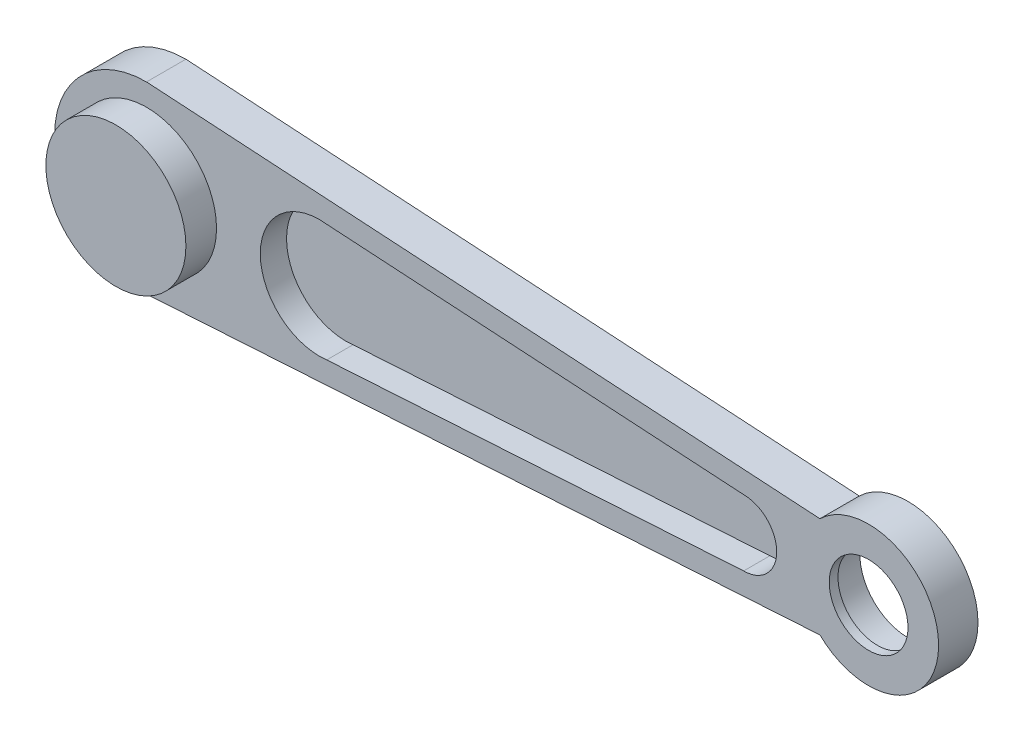
ISO-10303-21;
HEADER;
FILE_DESCRIPTION(('STEP AP214'),'2;1');
FILE_NAME('part.step','',(''),(''),'','','');
FILE_SCHEMA(('AUTOMOTIVE_DESIGN { 1 0 10303 214 1 1 1 1 }'));
ENDSEC;
DATA;
#1=APPLICATION_CONTEXT('core data for automotive mechanical design processes');
#2=APPLICATION_PROTOCOL_DEFINITION('international standard','automotive_design',2000,#1);
#3=PRODUCT_CONTEXT('',#1,'mechanical');
#4=PRODUCT('Part','Part','',(#3));
#5=PRODUCT_RELATED_PRODUCT_CATEGORY('part','',(#4));
#6=PRODUCT_DEFINITION_FORMATION('','',#4);
#7=PRODUCT_DEFINITION_CONTEXT('part definition',#1,'design');
#8=PRODUCT_DEFINITION('design','',#6,#7);
#9=PRODUCT_DEFINITION_SHAPE('','',#8);
#10=(LENGTH_UNIT() NAMED_UNIT(*) SI_UNIT(.MILLI.,.METRE.));
#11=(NAMED_UNIT(*) PLANE_ANGLE_UNIT() SI_UNIT($,.RADIAN.));
#12=(NAMED_UNIT(*) SI_UNIT($,.STERADIAN.) SOLID_ANGLE_UNIT());
#13=UNCERTAINTY_MEASURE_WITH_UNIT(LENGTH_MEASURE(1.E-05),#10,'distance_accuracy_value','');
#14=(GEOMETRIC_REPRESENTATION_CONTEXT(3) GLOBAL_UNCERTAINTY_ASSIGNED_CONTEXT((#13)) GLOBAL_UNIT_ASSIGNED_CONTEXT((#10,
#11,#12)) REPRESENTATION_CONTEXT('',''));
#15=CARTESIAN_POINT('',(0.,0.,0.));
#16=DIRECTION('',(0.,0.,1.));
#17=DIRECTION('',(1.,0.,0.));
#18=AXIS2_PLACEMENT_3D('',#15,#16,#17);
#19=CARTESIAN_POINT('',(0.979753678770363,15.8997190445717,9.));
#20=DIRECTION('',(0.0615041582195713,0.998106827209243,0.));
#21=DIRECTION('',(-0.998106827209243,0.0615041582195713,0.));
#22=AXIS2_PLACEMENT_3D('',#19,#20,#21);
#23=PLANE('',#22);
#24=DIRECTION('',(0.,0.,-1.));
#25=VECTOR('',#24,1.);
#26=CARTESIAN_POINT('',(39.5245567833211,13.5245567833206,9.));
#27=LINE('',#26,#25);
#28=CARTESIAN_POINT('',(39.5245567833211,13.5245567833206,3.));
#29=VERTEX_POINT('',#28);
#30=CARTESIAN_POINT('',(39.5245567833211,13.5245567833206,0.));
#31=VERTEX_POINT('',#30);
#32=EDGE_CURVE('E12',#29,#31,#27,.T.);
#33=ORIENTED_EDGE('',*,*,#32,.F.);
#34=DIRECTION('',(0.998106827209243,-0.0615041582195713,0.));
#35=VECTOR('',#34,1.);
#36=CARTESIAN_POINT('',(0.979753678770363,15.8997190445717,3.));
#37=LINE('',#36,#35);
#38=CARTESIAN_POINT('',(41.1850401991683,13.4222364384986,3.));
#39=VERTEX_POINT('',#38);
#40=EDGE_CURVE('E233',#29,#39,#37,.T.);
#41=ORIENTED_EDGE('',*,*,#40,.T.);
#42=DIRECTION('',(0.,0.,-1.));
#43=VECTOR('',#42,1.);
#44=CARTESIAN_POINT('',(41.1850401991683,13.4222364384986,9.));
#45=LINE('',#44,#43);
#46=CARTESIAN_POINT('',(41.1850401991683,13.4222364384986,0.));
#47=VERTEX_POINT('',#46);
#48=EDGE_CURVE('E110',#39,#47,#45,.T.);
#49=ORIENTED_EDGE('',*,*,#48,.T.);
#50=DIRECTION('',(0.998106827209243,-0.0615041582195713,0.));
#51=VECTOR('',#50,1.);
#52=CARTESIAN_POINT('',(0.979753678770363,15.8997190445717,0.));
#53=LINE('',#52,#51);
#54=EDGE_CURVE('E192',#31,#47,#53,.T.);
#55=ORIENTED_EDGE('',*,*,#54,.F.);
#56=EDGE_LOOP('',(#33,#41,#49,#55));
#57=FACE_BOUND('',#56,.T.);
#58=ADVANCED_FACE('F50',(#57),#23,.T.);
#59=CARTESIAN_POINT('',(0.979753678770363,-15.8997190445717,9.));
#60=DIRECTION('',(-0.0615041582195713,0.998106827209243,0.));
#61=DIRECTION('',(-0.998106827209243,-0.0615041582195713,0.));
#62=AXIS2_PLACEMENT_3D('',#59,#60,#61);
#63=PLANE('',#62);
#64=DIRECTION('',(0.998106827209243,0.0615041582195713,0.));
#65=VECTOR('',#64,1.);
#66=CARTESIAN_POINT('',(0.979753678770363,-15.8997190445717,3.));
#67=LINE('',#66,#65);
#68=CARTESIAN_POINT('',(39.5245567833211,-13.5245567833206,3.));
#69=VERTEX_POINT('',#68);
#70=CARTESIAN_POINT('',(41.1850401991683,-13.4222364384986,3.));
#71=VERTEX_POINT('',#70);
#72=EDGE_CURVE('E245',#69,#71,#67,.T.);
#73=ORIENTED_EDGE('',*,*,#72,.F.);
#74=DIRECTION('',(0.,0.,-1.));
#75=VECTOR('',#74,1.);
#76=CARTESIAN_POINT('',(39.5245567833211,-13.5245567833206,9.));
#77=LINE('',#76,#75);
#78=CARTESIAN_POINT('',(39.5245567833211,-13.5245567833206,0.));
#79=VERTEX_POINT('',#78);
#80=EDGE_CURVE('E154',#69,#79,#77,.T.);
#81=ORIENTED_EDGE('',*,*,#80,.T.);
#82=DIRECTION('',(0.998106827209243,0.0615041582195713,0.));
#83=VECTOR('',#82,1.);
#84=CARTESIAN_POINT('',(0.979753678770363,-15.8997190445717,0.));
#85=LINE('',#84,#83);
#86=CARTESIAN_POINT('',(41.1850401991683,-13.4222364384986,0.));
#87=VERTEX_POINT('',#86);
#88=EDGE_CURVE('E188',#79,#87,#85,.T.);
#89=ORIENTED_EDGE('',*,*,#88,.T.);
#90=DIRECTION('',(0.,0.,-1.));
#91=VECTOR('',#90,1.);
#92=CARTESIAN_POINT('',(41.1850401991683,-13.4222364384986,9.));
#93=LINE('',#92,#91);
#94=EDGE_CURVE('E152',#71,#87,#93,.T.);
#95=ORIENTED_EDGE('',*,*,#94,.F.);
#96=EDGE_LOOP('',(#73,#81,#89,#95));
#97=FACE_BOUND('',#96,.T.);
#98=ADVANCED_FACE('F221',(#97),#63,.F.);
#99=CARTESIAN_POINT('',(0.,0.,9.));
#100=DIRECTION('',(0.,0.,1.));
#101=DIRECTION('',(1.,0.,0.));
#102=AXIS2_PLACEMENT_3D('',#99,#100,#101);
#103=PLANE('',#102);
#104=DIRECTION('',(0.998099631751839,0.0616208170737997,0.));
#105=VECTOR('',#104,1.);
#106=CARTESIAN_POINT('',(1.29157801142174,-20.9202603729663,9.));
#107=LINE('',#106,#105);
#108=CARTESIAN_POINT('',(0.,-21.,9.));
#109=VERTEX_POINT('',#108);
#110=CARTESIAN_POINT('',(153.875702269356,-11.5,9.));
#111=VERTEX_POINT('',#110);
#112=EDGE_CURVE('E260',#109,#111,#107,.T.);
#113=ORIENTED_EDGE('',*,*,#112,.T.);
#114=CARTESIAN_POINT('',(165.,0.,9.));
#115=DIRECTION('',(0.,0.,1.));
#116=DIRECTION('',(1.,0.,0.));
#117=AXIS2_PLACEMENT_3D('',#114,#115,#116);
#118=CIRCLE('',#117,16.);
#119=CARTESIAN_POINT('',(153.875702269356,11.5,9.));
#120=VERTEX_POINT('',#119);
#121=EDGE_CURVE('E114',#111,#120,#118,.T.);
#122=ORIENTED_EDGE('',*,*,#121,.T.);
#123=DIRECTION('',(0.998099631751839,-0.0616208170737997,0.));
#124=VECTOR('',#123,1.);
#125=CARTESIAN_POINT('',(1.29157801142174,20.9202603729663,9.));
#126=LINE('',#125,#124);
#127=CARTESIAN_POINT('',(0.,21.,9.));
#128=VERTEX_POINT('',#127);
#129=EDGE_CURVE('E171',#128,#120,#126,.T.);
#130=ORIENTED_EDGE('',*,*,#129,.F.);
#131=CARTESIAN_POINT('',(0.,0.,9.));
#132=DIRECTION('',(0.,0.,1.));
#133=DIRECTION('',(1.,0.,0.));
#134=AXIS2_PLACEMENT_3D('',#131,#132,#133);
#135=CIRCLE('',#134,21.);
#136=EDGE_CURVE('E73',#128,#109,#135,.T.);
#137=ORIENTED_EDGE('',*,*,#136,.T.);
#138=EDGE_LOOP('',(#113,#122,#130,#137));
#139=FACE_BOUND('',#138,.T.);
#140=CARTESIAN_POINT('',(165.,0.,9.));
#141=DIRECTION('',(0.,0.,1.));
#142=DIRECTION('',(1.,0.,0.));
#143=AXIS2_PLACEMENT_3D('',#140,#141,#142);
#144=CIRCLE('',#143,9.00000000000001);
#145=CARTESIAN_POINT('',(174.,0.,9.));
#146=VERTEX_POINT('',#145);
#147=EDGE_CURVE('E197',#146,#146,#144,.T.);
#148=ORIENTED_EDGE('',*,*,#147,.F.);
#149=EDGE_LOOP('',(#148));
#150=FACE_BOUND('',#149,.T.);
#151=CARTESIAN_POINT('',(0.,0.,9.));
#152=DIRECTION('',(0.,0.,1.));
#153=DIRECTION('',(1.,0.,0.));
#154=AXIS2_PLACEMENT_3D('',#151,#152,#153);
#155=CIRCLE('',#154,16.);
#156=CARTESIAN_POINT('',(16.,0.,9.));
#157=VERTEX_POINT('',#156);
#158=EDGE_CURVE('E177',#157,#157,#155,.F.);
#159=ORIENTED_EDGE('',*,*,#158,.T.);
#160=EDGE_LOOP('',(#159));
#161=FACE_BOUND('',#160,.T.);
#162=CARTESIAN_POINT('',(39.5245567833211,0.,9.));
#163=DIRECTION('',(0.,0.,1.));
#164=DIRECTION('',(1.,0.,0.));
#165=AXIS2_PLACEMENT_3D('',#162,#163,#164);
#166=CIRCLE('',#165,13.5245567833206);
#167=CARTESIAN_POINT('',(41.1850401991683,13.4222364384986,9.));
#168=VERTEX_POINT('',#167);
#169=CARTESIAN_POINT('',(41.1850401991683,-13.4222364384986,9.));
#170=VERTEX_POINT('',#169);
#171=EDGE_CURVE('E158',#168,#170,#166,.T.);
#172=ORIENTED_EDGE('',*,*,#171,.F.);
#173=DIRECTION('',(0.998106827209243,-0.0615041582195713,0.));
#174=VECTOR('',#173,1.);
#175=CARTESIAN_POINT('',(0.979753678770363,15.8997190445717,9.));
#176=LINE('',#175,#174);
#177=CARTESIAN_POINT('',(136.447941368368,7.55205863163189,9.));
#178=VERTEX_POINT('',#177);
#179=EDGE_CURVE('E247',#168,#178,#176,.T.);
#180=ORIENTED_EDGE('',*,*,#179,.T.);
#181=CARTESIAN_POINT('',(136.447941368368,0.,9.));
#182=DIRECTION('',(0.,0.,1.));
#183=DIRECTION('',(1.,0.,0.));
#184=AXIS2_PLACEMENT_3D('',#181,#182,#183);
#185=CIRCLE('',#184,7.55205863163189);
#186=CARTESIAN_POINT('',(136.447941368368,-7.55205863163189,9.));
#187=VERTEX_POINT('',#186);
#188=EDGE_CURVE('E159',#187,#178,#185,.T.);
#189=ORIENTED_EDGE('',*,*,#188,.F.);
#190=DIRECTION('',(0.998106827209243,0.0615041582195713,0.));
#191=VECTOR('',#190,1.);
#192=CARTESIAN_POINT('',(0.979753678770363,-15.8997190445717,9.));
#193=LINE('',#192,#191);
#194=EDGE_CURVE('E143',#170,#187,#193,.T.);
#195=ORIENTED_EDGE('',*,*,#194,.F.);
#196=EDGE_LOOP('',(#172,#180,#189,#195));
#197=FACE_BOUND('',#196,.T.);
#198=ADVANCED_FACE('F156',(#139,#150,#161,#197),#103,.T.);
#199=CARTESIAN_POINT('',(1.29157801142174,-20.9202603729663,9.));
#200=DIRECTION('',(-0.0616208170737997,0.998099631751839,0.));
#201=DIRECTION('',(-0.998099631751839,-0.0616208170737997,0.));
#202=AXIS2_PLACEMENT_3D('',#199,#200,#201);
#203=PLANE('',#202);
#204=DIRECTION('',(0.998099631751839,0.0616208170737997,0.));
#205=VECTOR('',#204,1.);
#206=CARTESIAN_POINT('',(1.29157801142174,-20.9202603729663,0.));
#207=LINE('',#206,#205);
#208=CARTESIAN_POINT('',(0.,-21.,0.));
#209=VERTEX_POINT('',#208);
#210=CARTESIAN_POINT('',(153.875702269356,-11.5,0.));
#211=VERTEX_POINT('',#210);
#212=EDGE_CURVE('E174',#209,#211,#207,.T.);
#213=ORIENTED_EDGE('',*,*,#212,.T.);
#214=DIRECTION('',(0.,0.,-1.));
#215=VECTOR('',#214,1.);
#216=CARTESIAN_POINT('',(153.875702269356,-11.5,9.));
#217=LINE('',#216,#215);
#218=EDGE_CURVE('E202',#111,#211,#217,.T.);
#219=ORIENTED_EDGE('',*,*,#218,.F.);
#220=ORIENTED_EDGE('',*,*,#112,.F.);
#221=DIRECTION('',(0.,0.,-1.));
#222=VECTOR('',#221,1.);
#223=CARTESIAN_POINT('',(0.,-21.,9.));
#224=LINE('',#223,#222);
#225=EDGE_CURVE('E168',#109,#209,#224,.T.);
#226=ORIENTED_EDGE('',*,*,#225,.T.);
#227=EDGE_LOOP('',(#213,#219,#220,#226));
#228=FACE_BOUND('',#227,.T.);
#229=ADVANCED_FACE('F267',(#228),#203,.F.);
#230=CARTESIAN_POINT('',(165.,0.,9.));
#231=DIRECTION('',(0.,0.,-1.));
#232=DIRECTION('',(-1.,0.,0.));
#233=AXIS2_PLACEMENT_3D('',#230,#231,#232);
#234=CYLINDRICAL_SURFACE('',#233,16.);
#235=CARTESIAN_POINT('',(165.,0.,0.));
#236=DIRECTION('',(0.,0.,1.));
#237=DIRECTION('',(1.,0.,0.));
#238=AXIS2_PLACEMENT_3D('',#235,#236,#237);
#239=CIRCLE('',#238,16.);
#240=CARTESIAN_POINT('',(153.875702269356,11.5,0.));
#241=VERTEX_POINT('',#240);
#242=EDGE_CURVE('E178',#211,#241,#239,.T.);
#243=ORIENTED_EDGE('',*,*,#242,.T.);
#244=DIRECTION('',(0.,0.,-1.));
#245=VECTOR('',#244,1.);
#246=CARTESIAN_POINT('',(153.875702269356,11.5,9.));
#247=LINE('',#246,#245);
#248=EDGE_CURVE('E208',#120,#241,#247,.T.);
#249=ORIENTED_EDGE('',*,*,#248,.F.);
#250=ORIENTED_EDGE('',*,*,#121,.F.);
#251=ORIENTED_EDGE('',*,*,#218,.T.);
#252=EDGE_LOOP('',(#243,#249,#250,#251));
#253=FACE_BOUND('',#252,.T.);
#254=ADVANCED_FACE('F264',(#253),#234,.T.);
#255=CARTESIAN_POINT('',(1.29157801142174,20.9202603729663,9.));
#256=DIRECTION('',(0.0616208170737997,0.998099631751839,0.));
#257=DIRECTION('',(-0.998099631751839,0.0616208170737997,0.));
#258=AXIS2_PLACEMENT_3D('',#255,#256,#257);
#259=PLANE('',#258);
#260=DIRECTION('',(0.998099631751839,-0.0616208170737997,0.));
#261=VECTOR('',#260,1.);
#262=CARTESIAN_POINT('',(1.29157801142174,20.9202603729663,0.));
#263=LINE('',#262,#261);
#264=CARTESIAN_POINT('',(0.,21.,0.));
#265=VERTEX_POINT('',#264);
#266=EDGE_CURVE('E185',#265,#241,#263,.T.);
#267=ORIENTED_EDGE('',*,*,#266,.F.);
#268=DIRECTION('',(0.,0.,-1.));
#269=VECTOR('',#268,1.);
#270=CARTESIAN_POINT('',(0.,21.,9.));
#271=LINE('',#270,#269);
#272=EDGE_CURVE('E169',#128,#265,#271,.T.);
#273=ORIENTED_EDGE('',*,*,#272,.F.);
#274=ORIENTED_EDGE('',*,*,#129,.T.);
#275=ORIENTED_EDGE('',*,*,#248,.T.);
#276=EDGE_LOOP('',(#267,#273,#274,#275));
#277=FACE_BOUND('',#276,.T.);
#278=ADVANCED_FACE('F258',(#277),#259,.T.);
#279=CARTESIAN_POINT('',(0.,0.,9.));
#280=DIRECTION('',(0.,0.,-1.));
#281=DIRECTION('',(-1.,0.,0.));
#282=AXIS2_PLACEMENT_3D('',#279,#280,#281);
#283=CYLINDRICAL_SURFACE('',#282,21.);
#284=CARTESIAN_POINT('',(0.,0.,0.));
#285=DIRECTION('',(0.,0.,1.));
#286=DIRECTION('',(1.,0.,0.));
#287=AXIS2_PLACEMENT_3D('',#284,#285,#286);
#288=CIRCLE('',#287,21.);
#289=EDGE_CURVE('E184',#265,#209,#288,.T.);
#290=ORIENTED_EDGE('',*,*,#289,.T.);
#291=ORIENTED_EDGE('',*,*,#225,.F.);
#292=ORIENTED_EDGE('',*,*,#136,.F.);
#293=ORIENTED_EDGE('',*,*,#272,.T.);
#294=EDGE_LOOP('',(#290,#291,#292,#293));
#295=FACE_BOUND('',#294,.T.);
#296=ADVANCED_FACE('F270',(#295),#283,.T.);
#297=CARTESIAN_POINT('',(165.,0.,9.));
#298=DIRECTION('',(0.,0.,-1.));
#299=DIRECTION('',(-1.,0.,0.));
#300=AXIS2_PLACEMENT_3D('',#297,#298,#299);
#301=CYLINDRICAL_SURFACE('',#300,9.00000000000001);
#302=CARTESIAN_POINT('',(165.,0.,7.));
#303=DIRECTION('',(0.,0.,1.));
#304=DIRECTION('',(1.,0.,0.));
#305=AXIS2_PLACEMENT_3D('',#302,#303,#304);
#306=CIRCLE('',#305,9.00000000000001);
#307=CARTESIAN_POINT('',(174.,0.,7.));
#308=VERTEX_POINT('',#307);
#309=EDGE_CURVE('E51',#308,#308,#306,.T.);
#310=ORIENTED_EDGE('',*,*,#309,.F.);
#311=EDGE_LOOP('',(#310));
#312=FACE_BOUND('',#311,.T.);
#313=ORIENTED_EDGE('',*,*,#147,.T.);
#314=EDGE_LOOP('',(#313));
#315=FACE_BOUND('',#314,.T.);
#316=ADVANCED_FACE('F47',(#312,#315),#301,.F.);
#317=CARTESIAN_POINT('',(39.5245567833211,0.,9.));
#318=DIRECTION('',(0.,0.,-1.));
#319=DIRECTION('',(-1.,0.,0.));
#320=AXIS2_PLACEMENT_3D('',#317,#318,#319);
#321=CYLINDRICAL_SURFACE('',#320,13.5245567833206);
#322=CARTESIAN_POINT('',(39.5245567833211,0.,0.));
#323=DIRECTION('',(0.,0.,1.));
#324=DIRECTION('',(1.,0.,0.));
#325=AXIS2_PLACEMENT_3D('',#322,#323,#324);
#326=CIRCLE('',#325,13.5245567833206);
#327=EDGE_CURVE('E194',#47,#31,#326,.T.);
#328=ORIENTED_EDGE('',*,*,#327,.F.);
#329=ORIENTED_EDGE('',*,*,#48,.F.);
#330=EDGE_CURVE('E57',#168,#39,#45,.T.);
#331=ORIENTED_EDGE('',*,*,#330,.F.);
#332=ORIENTED_EDGE('',*,*,#171,.T.);
#333=EDGE_CURVE('E145',#170,#71,#93,.T.);
#334=ORIENTED_EDGE('',*,*,#333,.T.);
#335=ORIENTED_EDGE('',*,*,#94,.T.);
#336=CARTESIAN_POINT('',(39.5245567833211,0.,0.));
#337=DIRECTION('',(0.,0.,1.));
#338=DIRECTION('',(1.,0.,0.));
#339=AXIS2_PLACEMENT_3D('',#336,#337,#338);
#340=CIRCLE('',#339,13.5245567833206);
#341=EDGE_CURVE('E190',#79,#87,#340,.T.);
#342=ORIENTED_EDGE('',*,*,#341,.F.);
#343=ORIENTED_EDGE('',*,*,#80,.F.);
#344=CARTESIAN_POINT('',(39.5245567833211,0.,3.));
#345=DIRECTION('',(0.,0.,1.));
#346=DIRECTION('',(1.,0.,0.));
#347=AXIS2_PLACEMENT_3D('',#344,#345,#346);
#348=CIRCLE('',#347,13.5245567833206);
#349=EDGE_CURVE('E163',#29,#69,#348,.T.);
#350=ORIENTED_EDGE('',*,*,#349,.F.);
#351=ORIENTED_EDGE('',*,*,#32,.T.);
#352=EDGE_LOOP('',(#328,#329,#331,#332,#334,#335,#342,#343,#350,#351));
#353=FACE_BOUND('',#352,.T.);
#354=ADVANCED_FACE('F164',(#353),#321,.F.);
#355=CARTESIAN_POINT('',(0.,0.,0.));
#356=DIRECTION('',(0.,0.,1.));
#357=DIRECTION('',(1.,0.,0.));
#358=AXIS2_PLACEMENT_3D('',#355,#356,#357);
#359=PLANE('',#358);
#360=CARTESIAN_POINT('',(165.,0.,0.));
#361=DIRECTION('',(0.,0.,1.));
#362=DIRECTION('',(1.,0.,0.));
#363=AXIS2_PLACEMENT_3D('',#360,#361,#362);
#364=CIRCLE('',#363,11.);
#365=CARTESIAN_POINT('',(176.,0.,0.));
#366=VERTEX_POINT('',#365);
#367=EDGE_CURVE('E441',#366,#366,#364,.T.);
#368=ORIENTED_EDGE('',*,*,#367,.T.);
#369=EDGE_LOOP('',(#368));
#370=FACE_BOUND('',#369,.T.);
#371=ORIENTED_EDGE('',*,*,#212,.F.);
#372=ORIENTED_EDGE('',*,*,#289,.F.);
#373=ORIENTED_EDGE('',*,*,#266,.T.);
#374=ORIENTED_EDGE('',*,*,#242,.F.);
#375=EDGE_LOOP('',(#371,#372,#373,#374));
#376=FACE_BOUND('',#375,.T.);
#377=ORIENTED_EDGE('',*,*,#341,.T.);
#378=ORIENTED_EDGE('',*,*,#88,.F.);
#379=EDGE_LOOP('',(#377,#378));
#380=FACE_BOUND('',#379,.T.);
#381=ORIENTED_EDGE('',*,*,#54,.T.);
#382=ORIENTED_EDGE('',*,*,#327,.T.);
#383=EDGE_LOOP('',(#381,#382));
#384=FACE_BOUND('',#383,.T.);
#385=ADVANCED_FACE('F223',(#370,#376,#380,#384),#359,.F.);
#386=CARTESIAN_POINT('',(0.,0.,16.));
#387=DIRECTION('',(0.,0.,-1.));
#388=DIRECTION('',(-1.,0.,0.));
#389=AXIS2_PLACEMENT_3D('',#386,#387,#388);
#390=CYLINDRICAL_SURFACE('',#389,16.);
#391=ORIENTED_EDGE('',*,*,#158,.F.);
#392=EDGE_LOOP('',(#391));
#393=FACE_BOUND('',#392,.T.);
#394=CARTESIAN_POINT('',(0.,0.,16.));
#395=DIRECTION('',(0.,0.,1.));
#396=DIRECTION('',(1.,0.,0.));
#397=AXIS2_PLACEMENT_3D('',#394,#395,#396);
#398=CIRCLE('',#397,16.);
#399=CARTESIAN_POINT('',(16.,0.,16.));
#400=VERTEX_POINT('',#399);
#401=EDGE_CURVE('E249',#400,#400,#398,.T.);
#402=ORIENTED_EDGE('',*,*,#401,.F.);
#403=EDGE_LOOP('',(#402));
#404=FACE_BOUND('',#403,.T.);
#405=ADVANCED_FACE('F228',(#393,#404),#390,.T.);
#406=CARTESIAN_POINT('',(0.,0.,16.));
#407=DIRECTION('',(0.,0.,1.));
#408=DIRECTION('',(1.,0.,0.));
#409=AXIS2_PLACEMENT_3D('',#406,#407,#408);
#410=PLANE('',#409);
#411=ORIENTED_EDGE('',*,*,#401,.T.);
#412=EDGE_LOOP('',(#411));
#413=FACE_BOUND('',#412,.T.);
#414=ADVANCED_FACE('F304',(#413),#410,.T.);
#415=CARTESIAN_POINT('',(0.979753678770363,-15.8997190445717,16.001));
#416=DIRECTION('',(-0.0615041582195713,0.998106827209243,0.));
#417=DIRECTION('',(-0.998106827209243,-0.0615041582195713,0.));
#418=AXIS2_PLACEMENT_3D('',#415,#416,#417);
#419=PLANE('',#418);
#420=ORIENTED_EDGE('',*,*,#333,.F.);
#421=ORIENTED_EDGE('',*,*,#194,.T.);
#422=DIRECTION('',(0.,0.,-1.));
#423=VECTOR('',#422,1.);
#424=CARTESIAN_POINT('',(136.447941368368,-7.55205863163189,16.001));
#425=LINE('',#424,#423);
#426=CARTESIAN_POINT('',(136.447941368368,-7.55205863163189,3.));
#427=VERTEX_POINT('',#426);
#428=EDGE_CURVE('E63',#187,#427,#425,.T.);
#429=ORIENTED_EDGE('',*,*,#428,.T.);
#430=EDGE_CURVE('E147',#71,#427,#67,.T.);
#431=ORIENTED_EDGE('',*,*,#430,.F.);
#432=EDGE_LOOP('',(#420,#421,#429,#431));
#433=FACE_BOUND('',#432,.T.);
#434=ADVANCED_FACE('F144',(#433),#419,.T.);
#435=CARTESIAN_POINT('',(136.447941368368,0.,16.001));
#436=DIRECTION('',(0.,0.,-1.));
#437=DIRECTION('',(-1.,0.,0.));
#438=AXIS2_PLACEMENT_3D('',#435,#436,#437);
#439=CYLINDRICAL_SURFACE('',#438,7.55205863163189);
#440=ORIENTED_EDGE('',*,*,#188,.T.);
#441=DIRECTION('',(0.,0.,-1.));
#442=VECTOR('',#441,1.);
#443=CARTESIAN_POINT('',(136.447941368368,7.55205863163189,16.001));
#444=LINE('',#443,#442);
#445=CARTESIAN_POINT('',(136.447941368368,7.55205863163189,3.));
#446=VERTEX_POINT('',#445);
#447=EDGE_CURVE('E234',#178,#446,#444,.T.);
#448=ORIENTED_EDGE('',*,*,#447,.T.);
#449=CARTESIAN_POINT('',(136.447941368368,0.,3.));
#450=DIRECTION('',(0.,0.,1.));
#451=DIRECTION('',(1.,0.,0.));
#452=AXIS2_PLACEMENT_3D('',#449,#450,#451);
#453=CIRCLE('',#452,7.55205863163189);
#454=EDGE_CURVE('E237',#427,#446,#453,.T.);
#455=ORIENTED_EDGE('',*,*,#454,.F.);
#456=ORIENTED_EDGE('',*,*,#428,.F.);
#457=EDGE_LOOP('',(#440,#448,#455,#456));
#458=FACE_BOUND('',#457,.T.);
#459=ADVANCED_FACE('F379',(#458),#439,.F.);
#460=CARTESIAN_POINT('',(0.979753678770363,15.8997190445717,16.001));
#461=DIRECTION('',(0.0615041582195713,0.998106827209243,0.));
#462=DIRECTION('',(-0.998106827209243,0.0615041582195713,0.));
#463=AXIS2_PLACEMENT_3D('',#460,#461,#462);
#464=PLANE('',#463);
#465=EDGE_CURVE('E232',#39,#446,#37,.T.);
#466=ORIENTED_EDGE('',*,*,#465,.T.);
#467=ORIENTED_EDGE('',*,*,#447,.F.);
#468=ORIENTED_EDGE('',*,*,#179,.F.);
#469=ORIENTED_EDGE('',*,*,#330,.T.);
#470=EDGE_LOOP('',(#466,#467,#468,#469));
#471=FACE_BOUND('',#470,.T.);
#472=ADVANCED_FACE('F388',(#471),#464,.F.);
#473=CARTESIAN_POINT('',(0.,0.,3.));
#474=DIRECTION('',(0.,0.,1.));
#475=DIRECTION('',(1.,0.,0.));
#476=AXIS2_PLACEMENT_3D('',#473,#474,#475);
#477=PLANE('',#476);
#478=ORIENTED_EDGE('',*,*,#349,.T.);
#479=ORIENTED_EDGE('',*,*,#72,.T.);
#480=ORIENTED_EDGE('',*,*,#430,.T.);
#481=ORIENTED_EDGE('',*,*,#454,.T.);
#482=ORIENTED_EDGE('',*,*,#465,.F.);
#483=ORIENTED_EDGE('',*,*,#40,.F.);
#484=EDGE_LOOP('',(#478,#479,#480,#481,#482,#483));
#485=FACE_BOUND('',#484,.T.);
#486=ADVANCED_FACE('F398',(#485),#477,.T.);
#487=CARTESIAN_POINT('',(165.,0.,40.1126983722081));
#488=DIRECTION('',(0.,0.,-1.));
#489=DIRECTION('',(-1.,0.,0.));
#490=AXIS2_PLACEMENT_3D('',#487,#488,#489);
#491=CYLINDRICAL_SURFACE('',#490,11.);
#492=ORIENTED_EDGE('',*,*,#367,.F.);
#493=EDGE_LOOP('',(#492));
#494=FACE_BOUND('',#493,.T.);
#495=CARTESIAN_POINT('',(165.,0.,7.));
#496=DIRECTION('',(0.,0.,1.));
#497=DIRECTION('',(1.,0.,0.));
#498=AXIS2_PLACEMENT_3D('',#495,#496,#497);
#499=CIRCLE('',#498,11.);
#500=CARTESIAN_POINT('',(176.,0.,7.));
#501=VERTEX_POINT('',#500);
#502=EDGE_CURVE('E437',#501,#501,#499,.T.);
#503=ORIENTED_EDGE('',*,*,#502,.T.);
#504=EDGE_LOOP('',(#503));
#505=FACE_BOUND('',#504,.T.);
#506=ADVANCED_FACE('F407',(#494,#505),#491,.F.);
#507=CARTESIAN_POINT('',(0.,0.,7.));
#508=DIRECTION('',(0.,0.,1.));
#509=DIRECTION('',(1.,0.,0.));
#510=AXIS2_PLACEMENT_3D('',#507,#508,#509);
#511=PLANE('',#510);
#512=ORIENTED_EDGE('',*,*,#309,.T.);
#513=EDGE_LOOP('',(#512));
#514=FACE_BOUND('',#513,.T.);
#515=ORIENTED_EDGE('',*,*,#502,.F.);
#516=EDGE_LOOP('',(#515));
#517=FACE_BOUND('',#516,.T.);
#518=ADVANCED_FACE('F423',(#514,#517),#511,.F.);
#519=CLOSED_SHELL('',(#58,#98,#198,#229,#254,#278,#296,#316,#354,#385,#405,#414,#434,#459,#472,
#486,#506,#518));
#520=MANIFOLD_SOLID_BREP('B2',#519);
#521=ADVANCED_BREP_SHAPE_REPRESENTATION('',(#18,#520),#14);
#522=SHAPE_DEFINITION_REPRESENTATION(#9,#521);
ENDSEC;
END-ISO-10303-21;
